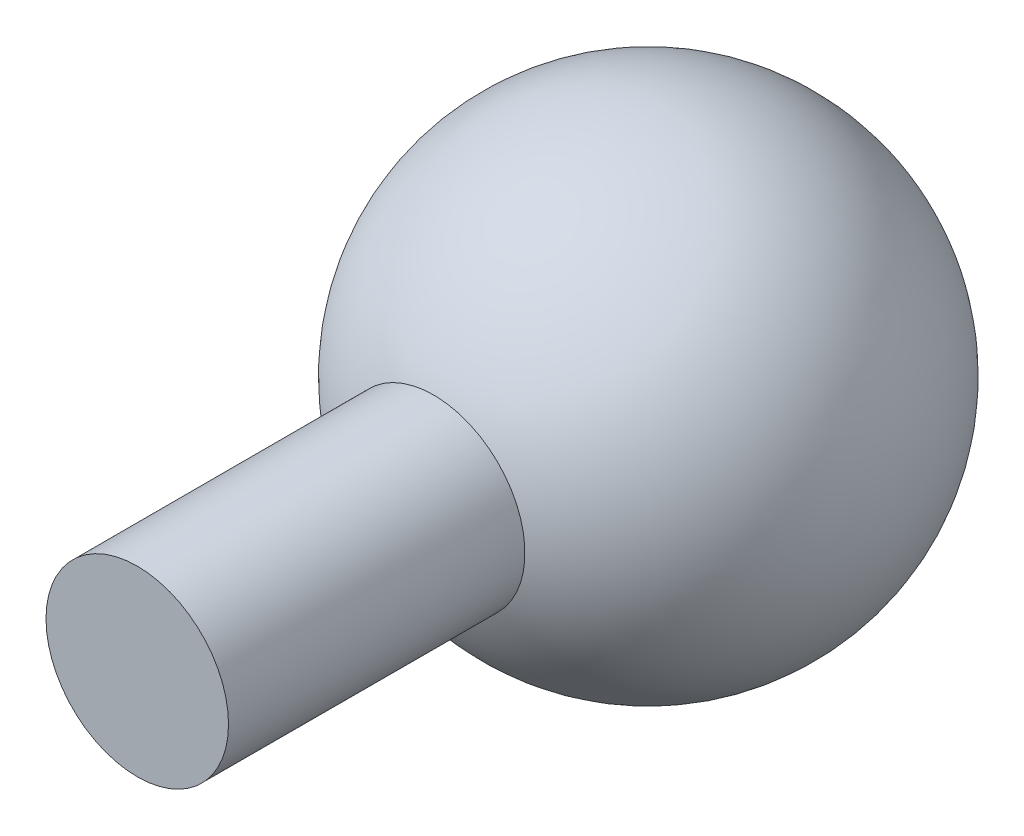
ISO-10303-21;
HEADER;
FILE_DESCRIPTION(('STEP AP214'),'2;1');
FILE_NAME('part.step','',(''),(''),'','','');
FILE_SCHEMA(('AUTOMOTIVE_DESIGN { 1 0 10303 214 1 1 1 1 }'));
ENDSEC;
DATA;
#1=APPLICATION_CONTEXT('core data for automotive mechanical design processes');
#2=APPLICATION_PROTOCOL_DEFINITION('international standard','automotive_design',2000,#1);
#3=PRODUCT_CONTEXT('',#1,'mechanical');
#4=PRODUCT('Part','Part','',(#3));
#5=PRODUCT_RELATED_PRODUCT_CATEGORY('part','',(#4));
#6=PRODUCT_DEFINITION_FORMATION('','',#4);
#7=PRODUCT_DEFINITION_CONTEXT('part definition',#1,'design');
#8=PRODUCT_DEFINITION('design','',#6,#7);
#9=PRODUCT_DEFINITION_SHAPE('','',#8);
#10=(LENGTH_UNIT() NAMED_UNIT(*) SI_UNIT(.MILLI.,.METRE.));
#11=(NAMED_UNIT(*) PLANE_ANGLE_UNIT() SI_UNIT($,.RADIAN.));
#12=(NAMED_UNIT(*) SI_UNIT($,.STERADIAN.) SOLID_ANGLE_UNIT());
#13=UNCERTAINTY_MEASURE_WITH_UNIT(LENGTH_MEASURE(1.E-05),#10,'distance_accuracy_value','');
#14=(GEOMETRIC_REPRESENTATION_CONTEXT(3) GLOBAL_UNCERTAINTY_ASSIGNED_CONTEXT((#13)) GLOBAL_UNIT_ASSIGNED_CONTEXT((#10,
#11,#12)) REPRESENTATION_CONTEXT('',''));
#15=CARTESIAN_POINT('',(0.,0.,0.));
#16=DIRECTION('',(0.,0.,1.));
#17=DIRECTION('',(1.,0.,0.));
#18=AXIS2_PLACEMENT_3D('',#15,#16,#17);
#19=CARTESIAN_POINT('',(0.,0.,0.));
#20=DIRECTION('',(0.,-1.,0.));
#21=DIRECTION('',(-1.,0.,0.));
#22=AXIS2_PLACEMENT_3D('',#19,#20,#21);
#23=SPHERICAL_SURFACE('',#22,6.38989884326073);
#24=CARTESIAN_POINT('',(0.,0.,0.));
#25=DIRECTION('',(0.,0.,-1.));
#26=DIRECTION('',(-1.,0.,0.));
#27=AXIS2_PLACEMENT_3D('',#24,#25,#26);
#28=SPHERICAL_SURFACE('',#27,6.38989884326073);
#29=CARTESIAN_POINT('',(0.,0.,5.88054480699746));
#30=DIRECTION('',(0.,0.,-1.));
#31=DIRECTION('',(-1.,0.,0.));
#32=AXIS2_PLACEMENT_3D('',#29,#30,#31);
#33=CIRCLE('',#32,2.5);
#34=CARTESIAN_POINT('',(-2.5,0.,5.88054480699746));
#35=VERTEX_POINT('',#34);
#36=EDGE_CURVE('E10',#35,#35,#33,.F.);
#37=ORIENTED_EDGE('',*,*,#36,.F.);
#38=EDGE_LOOP('',(#37));
#39=FACE_BOUND('',#38,.T.);
#40=ADVANCED_FACE('F29',(#39),#28,.T.);
#41=CARTESIAN_POINT('',(0.,0.,14.));
#42=DIRECTION('',(0.,0.,-1.));
#43=DIRECTION('',(-1.,0.,0.));
#44=AXIS2_PLACEMENT_3D('',#41,#42,#43);
#45=CYLINDRICAL_SURFACE('',#44,2.5);
#46=CARTESIAN_POINT('',(0.,0.,14.));
#47=DIRECTION('',(0.,0.,1.));
#48=DIRECTION('',(1.,0.,0.));
#49=AXIS2_PLACEMENT_3D('',#46,#47,#48);
#50=CIRCLE('',#49,2.5);
#51=CARTESIAN_POINT('',(2.5,0.,14.));
#52=VERTEX_POINT('',#51);
#53=EDGE_CURVE('E35',#52,#52,#50,.T.);
#54=ORIENTED_EDGE('',*,*,#53,.F.);
#55=EDGE_LOOP('',(#54));
#56=FACE_BOUND('',#55,.T.);
#57=ORIENTED_EDGE('',*,*,#36,.T.);
#58=EDGE_LOOP('',(#57));
#59=FACE_BOUND('',#58,.T.);
#60=ADVANCED_FACE('F43',(#56,#59),#45,.T.);
#61=CARTESIAN_POINT('',(0.,0.,14.));
#62=DIRECTION('',(0.,0.,1.));
#63=DIRECTION('',(1.,0.,0.));
#64=AXIS2_PLACEMENT_3D('',#61,#62,#63);
#65=PLANE('',#64);
#66=ORIENTED_EDGE('',*,*,#53,.T.);
#67=EDGE_LOOP('',(#66));
#68=FACE_BOUND('',#67,.T.);
#69=ADVANCED_FACE('F41',(#68),#65,.T.);
#70=CLOSED_SHELL('',(#40,#60,#69));
#71=MANIFOLD_SOLID_BREP('B2',#70);
#72=ADVANCED_BREP_SHAPE_REPRESENTATION('',(#18,#71),#14);
#73=SHAPE_DEFINITION_REPRESENTATION(#9,#72);
ENDSEC;
END-ISO-10303-21;
